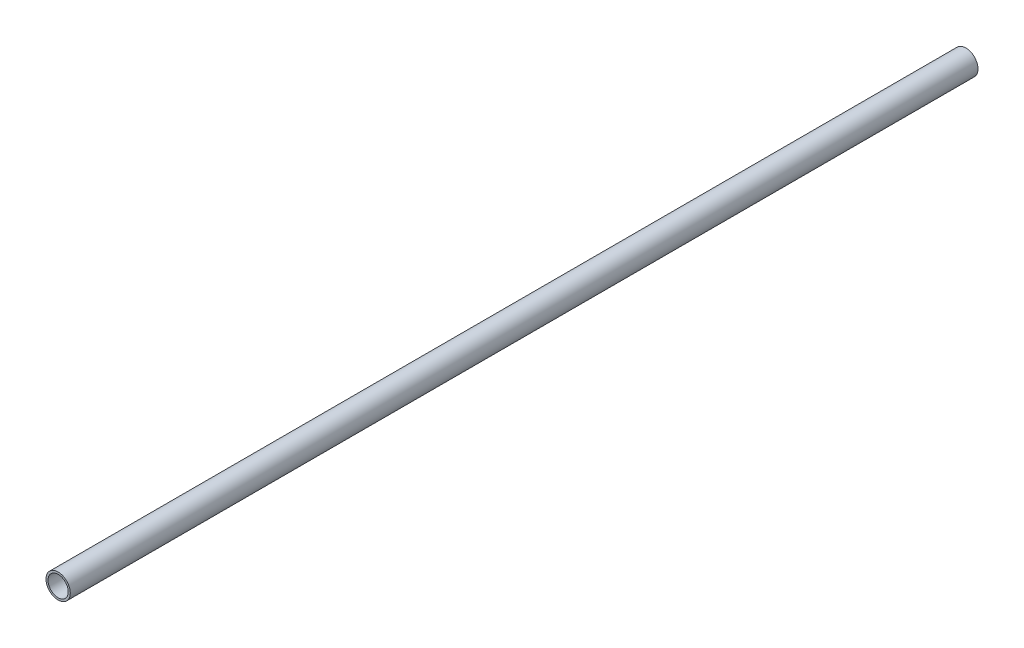
ISO-10303-21;
HEADER;
FILE_DESCRIPTION(('STEP AP214'),'2;1');
FILE_NAME('part.step','',(''),(''),'','','');
FILE_SCHEMA(('AUTOMOTIVE_DESIGN { 1 0 10303 214 1 1 1 1 }'));
ENDSEC;
DATA;
#1=APPLICATION_CONTEXT('core data for automotive mechanical design processes');
#2=APPLICATION_PROTOCOL_DEFINITION('international standard','automotive_design',2000,#1);
#3=PRODUCT_CONTEXT('',#1,'mechanical');
#4=PRODUCT('Part','Part','',(#3));
#5=PRODUCT_RELATED_PRODUCT_CATEGORY('part','',(#4));
#6=PRODUCT_DEFINITION_FORMATION('','',#4);
#7=PRODUCT_DEFINITION_CONTEXT('part definition',#1,'design');
#8=PRODUCT_DEFINITION('design','',#6,#7);
#9=PRODUCT_DEFINITION_SHAPE('','',#8);
#10=(LENGTH_UNIT() NAMED_UNIT(*) SI_UNIT(.MILLI.,.METRE.));
#11=(NAMED_UNIT(*) PLANE_ANGLE_UNIT() SI_UNIT($,.RADIAN.));
#12=(NAMED_UNIT(*) SI_UNIT($,.STERADIAN.) SOLID_ANGLE_UNIT());
#13=UNCERTAINTY_MEASURE_WITH_UNIT(LENGTH_MEASURE(1.E-05),#10,'distance_accuracy_value','');
#14=(GEOMETRIC_REPRESENTATION_CONTEXT(3) GLOBAL_UNCERTAINTY_ASSIGNED_CONTEXT((#13)) GLOBAL_UNIT_ASSIGNED_CONTEXT((#10,
#11,#12)) REPRESENTATION_CONTEXT('',''));
#15=CARTESIAN_POINT('',(0.,0.,0.));
#16=DIRECTION('',(0.,0.,1.));
#17=DIRECTION('',(1.,0.,0.));
#18=AXIS2_PLACEMENT_3D('',#15,#16,#17);
#19=CARTESIAN_POINT('',(0.,0.,672.24));
#20=DIRECTION('',(0.,0.,-1.));
#21=DIRECTION('',(-1.,0.,0.));
#22=AXIS2_PLACEMENT_3D('',#19,#20,#21);
#23=CYLINDRICAL_SURFACE('',#22,9.);
#24=CARTESIAN_POINT('',(0.,0.,672.24));
#25=DIRECTION('',(0.,0.,1.));
#26=DIRECTION('',(1.,0.,0.));
#27=AXIS2_PLACEMENT_3D('',#24,#25,#26);
#28=CIRCLE('',#27,9.);
#29=CARTESIAN_POINT('',(9.,0.,672.24));
#30=VERTEX_POINT('',#29);
#31=EDGE_CURVE('E10',#30,#30,#28,.T.);
#32=ORIENTED_EDGE('',*,*,#31,.F.);
#33=EDGE_LOOP('',(#32));
#34=FACE_BOUND('',#33,.T.);
#35=CARTESIAN_POINT('',(0.,0.,0.));
#36=DIRECTION('',(0.,0.,1.));
#37=DIRECTION('',(1.,0.,0.));
#38=AXIS2_PLACEMENT_3D('',#35,#36,#37);
#39=CIRCLE('',#38,9.);
#40=CARTESIAN_POINT('',(9.,0.,0.));
#41=VERTEX_POINT('',#40);
#42=EDGE_CURVE('E34',#41,#41,#39,.T.);
#43=ORIENTED_EDGE('',*,*,#42,.T.);
#44=EDGE_LOOP('',(#43));
#45=FACE_BOUND('',#44,.T.);
#46=ADVANCED_FACE('F31',(#34,#45),#23,.T.);
#47=CARTESIAN_POINT('',(0.,0.,672.24));
#48=DIRECTION('',(0.,0.,1.));
#49=DIRECTION('',(1.,0.,0.));
#50=AXIS2_PLACEMENT_3D('',#47,#48,#49);
#51=PLANE('',#50);
#52=CARTESIAN_POINT('',(0.,0.,672.24));
#53=DIRECTION('',(0.,0.,-1.));
#54=DIRECTION('',(-1.,0.,0.));
#55=AXIS2_PLACEMENT_3D('',#52,#53,#54);
#56=CIRCLE('',#55,7.5);
#57=CARTESIAN_POINT('',(-7.5,0.,672.24));
#58=VERTEX_POINT('',#57);
#59=EDGE_CURVE('E41',#58,#58,#56,.T.);
#60=ORIENTED_EDGE('',*,*,#59,.T.);
#61=EDGE_LOOP('',(#60));
#62=FACE_BOUND('',#61,.T.);
#63=ORIENTED_EDGE('',*,*,#31,.T.);
#64=EDGE_LOOP('',(#63));
#65=FACE_BOUND('',#64,.T.);
#66=ADVANCED_FACE('F49',(#62,#65),#51,.T.);
#67=CARTESIAN_POINT('',(0.,0.,0.));
#68=DIRECTION('',(0.,0.,1.));
#69=DIRECTION('',(1.,0.,0.));
#70=AXIS2_PLACEMENT_3D('',#67,#68,#69);
#71=PLANE('',#70);
#72=CARTESIAN_POINT('',(0.,0.,0.));
#73=DIRECTION('',(0.,0.,-1.));
#74=DIRECTION('',(-1.,0.,0.));
#75=AXIS2_PLACEMENT_3D('',#72,#73,#74);
#76=CIRCLE('',#75,7.5);
#77=CARTESIAN_POINT('',(-7.5,0.,0.));
#78=VERTEX_POINT('',#77);
#79=EDGE_CURVE('E43',#78,#78,#76,.T.);
#80=ORIENTED_EDGE('',*,*,#79,.F.);
#81=EDGE_LOOP('',(#80));
#82=FACE_BOUND('',#81,.T.);
#83=ORIENTED_EDGE('',*,*,#42,.F.);
#84=EDGE_LOOP('',(#83));
#85=FACE_BOUND('',#84,.T.);
#86=ADVANCED_FACE('F54',(#82,#85),#71,.F.);
#87=CARTESIAN_POINT('',(0.,0.,672.24));
#88=DIRECTION('',(0.,0.,-1.));
#89=DIRECTION('',(-1.,0.,0.));
#90=AXIS2_PLACEMENT_3D('',#87,#88,#89);
#91=CYLINDRICAL_SURFACE('',#90,7.5);
#92=ORIENTED_EDGE('',*,*,#59,.F.);
#93=EDGE_LOOP('',(#92));
#94=FACE_BOUND('',#93,.T.);
#95=ORIENTED_EDGE('',*,*,#79,.T.);
#96=EDGE_LOOP('',(#95));
#97=FACE_BOUND('',#96,.T.);
#98=ADVANCED_FACE('F51',(#94,#97),#91,.F.);
#99=CLOSED_SHELL('',(#46,#66,#86,#98));
#100=MANIFOLD_SOLID_BREP('B2',#99);
#101=ADVANCED_BREP_SHAPE_REPRESENTATION('',(#18,#100),#14);
#102=SHAPE_DEFINITION_REPRESENTATION(#9,#101);
ENDSEC;
END-ISO-10303-21;
